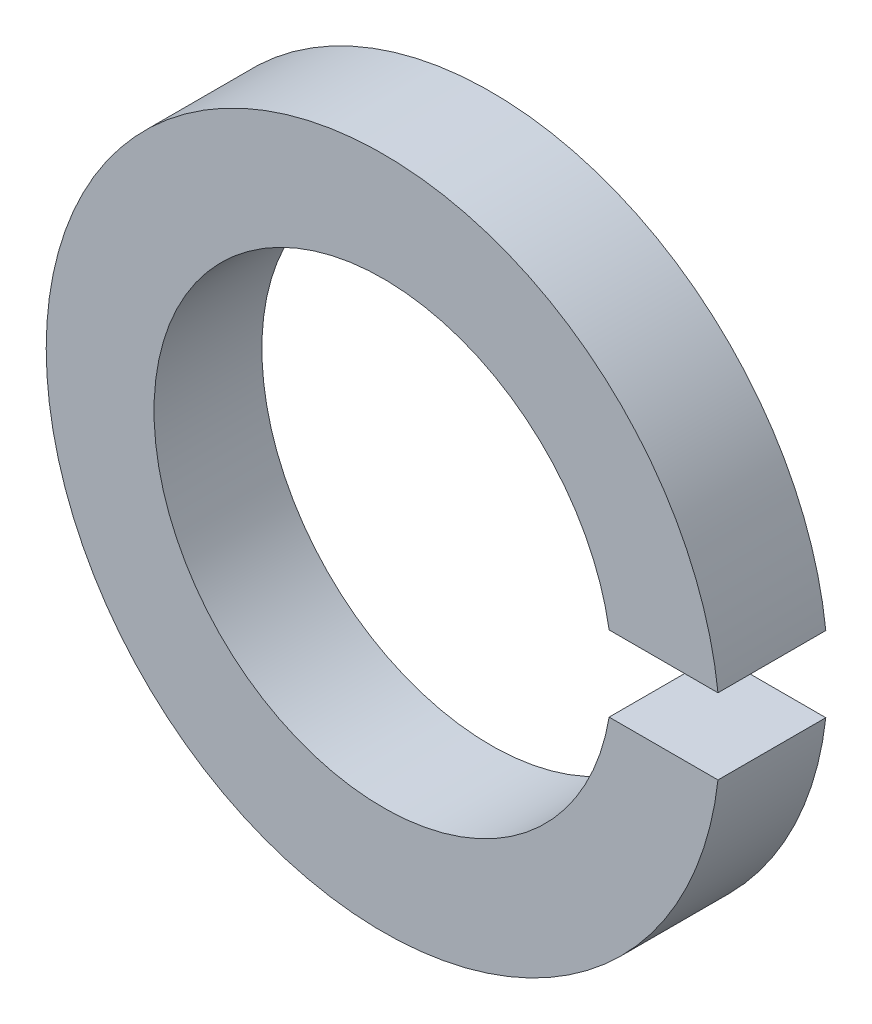
ISO-10303-21;
HEADER;
FILE_DESCRIPTION(('STEP AP214'),'2;1');
FILE_NAME('part.step','',(''),(''),'','','');
FILE_SCHEMA(('AUTOMOTIVE_DESIGN { 1 0 10303 214 1 1 1 1 }'));
ENDSEC;
DATA;
#1=APPLICATION_CONTEXT('core data for automotive mechanical design processes');
#2=APPLICATION_PROTOCOL_DEFINITION('international standard','automotive_design',2000,#1);
#3=PRODUCT_CONTEXT('',#1,'mechanical');
#4=PRODUCT('Part','Part','',(#3));
#5=PRODUCT_RELATED_PRODUCT_CATEGORY('part','',(#4));
#6=PRODUCT_DEFINITION_FORMATION('','',#4);
#7=PRODUCT_DEFINITION_CONTEXT('part definition',#1,'design');
#8=PRODUCT_DEFINITION('design','',#6,#7);
#9=PRODUCT_DEFINITION_SHAPE('','',#8);
#10=(LENGTH_UNIT() NAMED_UNIT(*) SI_UNIT(.MILLI.,.METRE.));
#11=(NAMED_UNIT(*) PLANE_ANGLE_UNIT() SI_UNIT($,.RADIAN.));
#12=(NAMED_UNIT(*) SI_UNIT($,.STERADIAN.) SOLID_ANGLE_UNIT());
#13=UNCERTAINTY_MEASURE_WITH_UNIT(LENGTH_MEASURE(1.E-05),#10,'distance_accuracy_value','');
#14=(GEOMETRIC_REPRESENTATION_CONTEXT(3) GLOBAL_UNCERTAINTY_ASSIGNED_CONTEXT((#13)) GLOBAL_UNIT_ASSIGNED_CONTEXT((#10,
#11,#12)) REPRESENTATION_CONTEXT('',''));
#15=CARTESIAN_POINT('',(0.,0.,0.));
#16=DIRECTION('',(0.,0.,1.));
#17=DIRECTION('',(1.,0.,0.));
#18=AXIS2_PLACEMENT_3D('',#15,#16,#17);
#19=CARTESIAN_POINT('',(0.,0.,1.2));
#20=DIRECTION('',(0.,0.,1.));
#21=DIRECTION('',(1.,0.,0.));
#22=AXIS2_PLACEMENT_3D('',#19,#20,#21);
#23=PLANE('',#22);
#24=DIRECTION('',(-1.,0.,0.));
#25=VECTOR('',#24,1.);
#26=CARTESIAN_POINT('',(2.43624306792177,0.42,1.2));
#27=LINE('',#26,#25);
#28=CARTESIAN_POINT('',(3.72640577500626,0.42,1.2));
#29=VERTEX_POINT('',#28);
#30=CARTESIAN_POINT('',(2.51517395024678,0.42,1.2));
#31=VERTEX_POINT('',#30);
#32=EDGE_CURVE('E50',#29,#31,#27,.T.);
#33=ORIENTED_EDGE('',*,*,#32,.F.);
#34=CARTESIAN_POINT('',(0.,0.,1.2));
#35=DIRECTION('',(0.,0.,1.));
#36=DIRECTION('',(1.,0.,0.));
#37=AXIS2_PLACEMENT_3D('',#34,#35,#36);
#38=CIRCLE('',#37,3.75);
#39=CARTESIAN_POINT('',(3.72640577500626,-0.42,1.2));
#40=VERTEX_POINT('',#39);
#41=EDGE_CURVE('E73',#29,#40,#38,.T.);
#42=ORIENTED_EDGE('',*,*,#41,.T.);
#43=DIRECTION('',(1.,0.,0.));
#44=VECTOR('',#43,1.);
#45=CARTESIAN_POINT('',(2.43624306792177,-0.42,1.2));
#46=LINE('',#45,#44);
#47=CARTESIAN_POINT('',(2.51517395024678,-0.42,1.2));
#48=VERTEX_POINT('',#47);
#49=EDGE_CURVE('E67',#48,#40,#46,.T.);
#50=ORIENTED_EDGE('',*,*,#49,.F.);
#51=CARTESIAN_POINT('',(0.,0.,1.2));
#52=DIRECTION('',(0.,0.,1.));
#53=DIRECTION('',(1.,0.,0.));
#54=AXIS2_PLACEMENT_3D('',#51,#52,#53);
#55=CIRCLE('',#54,2.55);
#56=EDGE_CURVE('E77',#31,#48,#55,.T.);
#57=ORIENTED_EDGE('',*,*,#56,.F.);
#58=EDGE_LOOP('',(#33,#42,#50,#57));
#59=FACE_BOUND('',#58,.T.);
#60=ADVANCED_FACE('F28',(#59),#23,.T.);
#61=CARTESIAN_POINT('',(0.,0.,0.));
#62=DIRECTION('',(0.,0.,1.));
#63=DIRECTION('',(1.,0.,0.));
#64=AXIS2_PLACEMENT_3D('',#61,#62,#63);
#65=PLANE('',#64);
#66=CARTESIAN_POINT('',(0.,0.,0.));
#67=DIRECTION('',(0.,0.,1.));
#68=DIRECTION('',(1.,0.,0.));
#69=AXIS2_PLACEMENT_3D('',#66,#67,#68);
#70=CIRCLE('',#69,3.75);
#71=CARTESIAN_POINT('',(3.72640577500626,0.42,0.));
#72=VERTEX_POINT('',#71);
#73=CARTESIAN_POINT('',(3.72640577500626,-0.42,0.));
#74=VERTEX_POINT('',#73);
#75=EDGE_CURVE('E81',#72,#74,#70,.T.);
#76=ORIENTED_EDGE('',*,*,#75,.F.);
#77=DIRECTION('',(-1.,0.,0.));
#78=VECTOR('',#77,1.);
#79=CARTESIAN_POINT('',(2.43624306792177,0.42,0.));
#80=LINE('',#79,#78);
#81=CARTESIAN_POINT('',(2.51517395024678,0.42,0.));
#82=VERTEX_POINT('',#81);
#83=EDGE_CURVE('E94',#72,#82,#80,.T.);
#84=ORIENTED_EDGE('',*,*,#83,.T.);
#85=CARTESIAN_POINT('',(0.,0.,0.));
#86=DIRECTION('',(0.,0.,1.));
#87=DIRECTION('',(1.,0.,0.));
#88=AXIS2_PLACEMENT_3D('',#85,#86,#87);
#89=CIRCLE('',#88,2.55);
#90=CARTESIAN_POINT('',(2.51517395024678,-0.42,0.));
#91=VERTEX_POINT('',#90);
#92=EDGE_CURVE('E82',#82,#91,#89,.T.);
#93=ORIENTED_EDGE('',*,*,#92,.T.);
#94=DIRECTION('',(1.,0.,0.));
#95=VECTOR('',#94,1.);
#96=CARTESIAN_POINT('',(2.43624306792177,-0.42,0.));
#97=LINE('',#96,#95);
#98=EDGE_CURVE('E43',#91,#74,#97,.T.);
#99=ORIENTED_EDGE('',*,*,#98,.T.);
#100=EDGE_LOOP('',(#76,#84,#93,#99));
#101=FACE_BOUND('',#100,.T.);
#102=ADVANCED_FACE('F100',(#101),#65,.F.);
#103=CARTESIAN_POINT('',(0.,0.,1.2));
#104=DIRECTION('',(0.,0.,-1.));
#105=DIRECTION('',(-1.,0.,0.));
#106=AXIS2_PLACEMENT_3D('',#103,#104,#105);
#107=CYLINDRICAL_SURFACE('',#106,3.75);
#108=ORIENTED_EDGE('',*,*,#41,.F.);
#109=DIRECTION('',(0.,0.,-1.));
#110=VECTOR('',#109,1.);
#111=CARTESIAN_POINT('',(3.72640577500626,0.42,1.2));
#112=LINE('',#111,#110);
#113=EDGE_CURVE('E86',#29,#72,#112,.T.);
#114=ORIENTED_EDGE('',*,*,#113,.T.);
#115=ORIENTED_EDGE('',*,*,#75,.T.);
#116=DIRECTION('',(0.,0.,-1.));
#117=VECTOR('',#116,1.);
#118=CARTESIAN_POINT('',(3.72640577500626,-0.42,1.2));
#119=LINE('',#118,#117);
#120=EDGE_CURVE('E92',#74,#40,#119,.F.);
#121=ORIENTED_EDGE('',*,*,#120,.T.);
#122=EDGE_LOOP('',(#108,#114,#115,#121));
#123=FACE_BOUND('',#122,.T.);
#124=ADVANCED_FACE('F30',(#123),#107,.T.);
#125=CARTESIAN_POINT('',(0.,0.,1.2));
#126=DIRECTION('',(0.,0.,-1.));
#127=DIRECTION('',(-1.,0.,0.));
#128=AXIS2_PLACEMENT_3D('',#125,#126,#127);
#129=CYLINDRICAL_SURFACE('',#128,2.55);
#130=DIRECTION('',(0.,0.,-1.));
#131=VECTOR('',#130,1.);
#132=CARTESIAN_POINT('',(2.51517395024678,0.42,1.2));
#133=LINE('',#132,#131);
#134=EDGE_CURVE('E11',#31,#82,#133,.T.);
#135=ORIENTED_EDGE('',*,*,#134,.F.);
#136=ORIENTED_EDGE('',*,*,#56,.T.);
#137=DIRECTION('',(0.,0.,-1.));
#138=VECTOR('',#137,1.);
#139=CARTESIAN_POINT('',(2.51517395024678,-0.42,1.2));
#140=LINE('',#139,#138);
#141=EDGE_CURVE('E36',#91,#48,#140,.F.);
#142=ORIENTED_EDGE('',*,*,#141,.F.);
#143=ORIENTED_EDGE('',*,*,#92,.F.);
#144=EDGE_LOOP('',(#135,#136,#142,#143));
#145=FACE_BOUND('',#144,.T.);
#146=ADVANCED_FACE('F80',(#145),#129,.F.);
#147=CARTESIAN_POINT('',(2.43624306792177,-0.42,0.));
#148=DIRECTION('',(0.,-1.,0.));
#149=DIRECTION('',(0.,0.,-1.));
#150=AXIS2_PLACEMENT_3D('',#147,#148,#149);
#151=PLANE('',#150);
#152=ORIENTED_EDGE('',*,*,#98,.F.);
#153=ORIENTED_EDGE('',*,*,#141,.T.);
#154=ORIENTED_EDGE('',*,*,#49,.T.);
#155=ORIENTED_EDGE('',*,*,#120,.F.);
#156=EDGE_LOOP('',(#152,#153,#154,#155));
#157=FACE_BOUND('',#156,.T.);
#158=ADVANCED_FACE('F66',(#157),#151,.F.);
#159=CARTESIAN_POINT('',(2.43624306792177,0.42,0.));
#160=DIRECTION('',(0.,1.,0.));
#161=DIRECTION('',(0.,0.,1.));
#162=AXIS2_PLACEMENT_3D('',#159,#160,#161);
#163=PLANE('',#162);
#164=ORIENTED_EDGE('',*,*,#32,.T.);
#165=ORIENTED_EDGE('',*,*,#134,.T.);
#166=ORIENTED_EDGE('',*,*,#83,.F.);
#167=ORIENTED_EDGE('',*,*,#113,.F.);
#168=EDGE_LOOP('',(#164,#165,#166,#167));
#169=FACE_BOUND('',#168,.T.);
#170=ADVANCED_FACE('F102',(#169),#163,.F.);
#171=CLOSED_SHELL('',(#60,#102,#124,#146,#158,#170));
#172=MANIFOLD_SOLID_BREP('B2',#171);
#173=ADVANCED_BREP_SHAPE_REPRESENTATION('',(#18,#172),#14);
#174=SHAPE_DEFINITION_REPRESENTATION(#9,#173);
ENDSEC;
END-ISO-10303-21;
